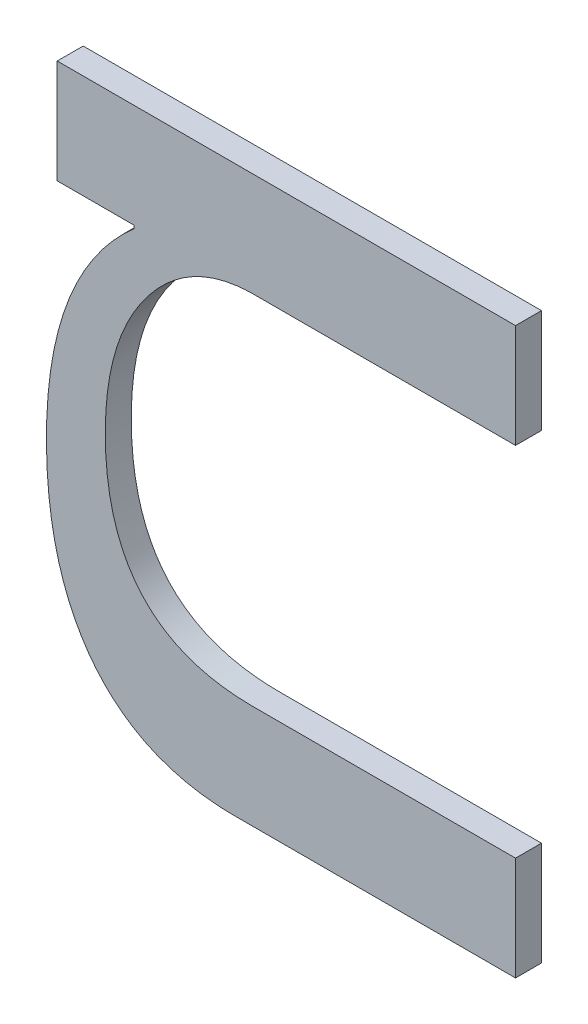
ISO-10303-21;
HEADER;
FILE_DESCRIPTION(('STEP AP214'),'2;1');
FILE_NAME('part.step','',(''),(''),'','','');
FILE_SCHEMA(('AUTOMOTIVE_DESIGN { 1 0 10303 214 1 1 1 1 }'));
ENDSEC;
DATA;
#1=APPLICATION_CONTEXT('core data for automotive mechanical design processes');
#2=APPLICATION_PROTOCOL_DEFINITION('international standard','automotive_design',2000,#1);
#3=PRODUCT_CONTEXT('',#1,'mechanical');
#4=PRODUCT('Part','Part','',(#3));
#5=PRODUCT_RELATED_PRODUCT_CATEGORY('part','',(#4));
#6=PRODUCT_DEFINITION_FORMATION('','',#4);
#7=PRODUCT_DEFINITION_CONTEXT('part definition',#1,'design');
#8=PRODUCT_DEFINITION('design','',#6,#7);
#9=PRODUCT_DEFINITION_SHAPE('','',#8);
#10=(LENGTH_UNIT() NAMED_UNIT(*) SI_UNIT(.MILLI.,.METRE.));
#11=(NAMED_UNIT(*) PLANE_ANGLE_UNIT() SI_UNIT($,.RADIAN.));
#12=(NAMED_UNIT(*) SI_UNIT($,.STERADIAN.) SOLID_ANGLE_UNIT());
#13=UNCERTAINTY_MEASURE_WITH_UNIT(LENGTH_MEASURE(1.E-05),#10,'distance_accuracy_value','');
#14=(GEOMETRIC_REPRESENTATION_CONTEXT(3) GLOBAL_UNCERTAINTY_ASSIGNED_CONTEXT((#13)) GLOBAL_UNIT_ASSIGNED_CONTEXT((#10,
#11,#12)) REPRESENTATION_CONTEXT('',''));
#15=CARTESIAN_POINT('',(0.,0.,0.));
#16=DIRECTION('',(0.,0.,1.));
#17=DIRECTION('',(1.,0.,0.));
#18=AXIS2_PLACEMENT_3D('',#15,#16,#17);
#19=CARTESIAN_POINT('',(-8.95983005625009,-22.770458436575,135.210489149433));
#20=DIRECTION('',(0.,0.,-1.));
#21=DIRECTION('',(0.,-1.,0.));
#22=AXIS2_PLACEMENT_3D('',#19,#20,#21);
#23=PLANE('',#22);
#24=CARTESIAN_POINT('',(-6.41452319026449,2.21337900735486,135.210489149433));
#25=CARTESIAN_POINT('',(-7.42338738324791,2.21337900735486,135.210489149433));
#26=CARTESIAN_POINT('',(-8.43225157623134,2.21337900735486,135.210489149433));
#27=CARTESIAN_POINT('',(-10.5840689654579,2.21337900735486,135.210489149433));
#28=CARTESIAN_POINT('',(-11.1555470427801,2.84072670043146,135.210489149433));
#29=CARTESIAN_POINT('',(-11.1555459531499,4.75150269201786,135.210489149433));
#30=CARTESIAN_POINT('',(-10.9919250064618,5.29025539691216,135.210489149433));
#31=CARTESIAN_POINT('',(-10.3374403582215,6.13310378538347,135.210489149433));
#32=CARTESIAN_POINT('',(-9.92798836002439,6.34381583127306,135.210489149433));
#33=CARTESIAN_POINT('',(-8.42905893822012,6.34381583127306,135.210489149433));
#34=CARTESIAN_POINT('',(-7.4217910642423,6.34381583127306,135.210489149433));
#35=CARTESIAN_POINT('',(-6.41452319026449,6.34381583127306,135.210489149433));
#36=(BOUNDED_CURVE() B_SPLINE_CURVE(3,(#24,#25,#26,#27,#28,#29,#30,#31,#32,#33,#34,#35),
.UNSPECIFIED.,.F.,.F.) B_SPLINE_CURVE_WITH_KNOTS((4,2,2,2,2,4),(0.,0.220684096034556,
0.47069950413109,0.601432808643403,0.732166223682619,1.),
.UNSPECIFIED.) CURVE() GEOMETRIC_REPRESENTATION_ITEM() RATIONAL_B_SPLINE_CURVE((1.,1.,1.,1.,1.,
1.,1.,1.,1.,1.,1.,1.)) REPRESENTATION_ITEM(''));
#37=CARTESIAN_POINT('',(-6.41452319026449,2.21337900735486,135.210489149433));
#38=VERTEX_POINT('',#37);
#39=CARTESIAN_POINT('',(-6.41452319026449,6.34381583127306,135.210489149433));
#40=VERTEX_POINT('',#39);
#41=EDGE_CURVE('E11',#38,#40,#36,.T.);
#42=ORIENTED_EDGE('',*,*,#41,.T.);
#43=DIRECTION('',(0.,1.,0.));
#44=VECTOR('',#43,1.);
#45=CARTESIAN_POINT('',(-6.41452319026449,5.40908312699247,135.210489149433));
#46=LINE('',#45,#44);
#47=CARTESIAN_POINT('',(-6.41452319026449,7.54343835230677,135.210489149433));
#48=VERTEX_POINT('',#47);
#49=EDGE_CURVE('E265',#40,#48,#46,.T.);
#50=ORIENTED_EDGE('',*,*,#49,.T.);
#51=DIRECTION('',(-1.,0.,0.));
#52=VECTOR('',#51,1.);
#53=CARTESIAN_POINT('',(2.66453525910038E-13,7.54343835230677,135.210489149433));
#54=LINE('',#53,#52);
#55=CARTESIAN_POINT('',(-11.7110601493991,7.54343835230677,135.210489149433));
#56=VERTEX_POINT('',#55);
#57=EDGE_CURVE('E241',#48,#56,#54,.T.);
#58=ORIENTED_EDGE('',*,*,#57,.T.);
#59=DIRECTION('',(0.,-1.,0.));
#60=VECTOR('',#59,1.);
#61=CARTESIAN_POINT('',(-11.7110601493991,5.40908312699247,135.210489149433));
#62=LINE('',#61,#60);
#63=CARTESIAN_POINT('',(-11.7110601493991,6.34381583127306,135.210489149433));
#64=VERTEX_POINT('',#63);
#65=EDGE_CURVE('E143',#56,#64,#62,.T.);
#66=ORIENTED_EDGE('',*,*,#65,.T.);
#67=DIRECTION('',(1.,0.,0.));
#68=VECTOR('',#67,1.);
#69=CARTESIAN_POINT('',(2.66453525910038E-13,6.34381583127306,135.210489149433));
#70=LINE('',#69,#68);
#71=CARTESIAN_POINT('',(-10.8251113813703,6.34381583127306,135.210489149433));
#72=VERTEX_POINT('',#71);
#73=EDGE_CURVE('E125',#64,#72,#70,.T.);
#74=ORIENTED_EDGE('',*,*,#73,.T.);
#75=DIRECTION('',(0.,-1.,0.));
#76=VECTOR('',#75,1.);
#77=CARTESIAN_POINT('',(-10.8251113813703,5.40908312699247,135.210489149433));
#78=LINE('',#77,#76);
#79=CARTESIAN_POINT('',(-10.8251113813703,6.30789898932597,135.210489149433));
#80=VERTEX_POINT('',#79);
#81=EDGE_CURVE('E116',#72,#80,#78,.T.);
#82=ORIENTED_EDGE('',*,*,#81,.T.);
#83=CARTESIAN_POINT('',(-10.8251113813703,6.30789898932597,135.210489149433));
#84=CARTESIAN_POINT('',(-11.4987515811782,5.71407405620057,135.210489149433));
#85=CARTESIAN_POINT('',(-11.8355718681491,4.84488648108036,135.210489149433));
#86=CARTESIAN_POINT('',(-11.8355718681491,2.82875460684916,135.210489149433));
#87=CARTESIAN_POINT('',(-11.6488042900241,2.16309542862887,135.210489149433));
#88=CARTESIAN_POINT('',(-10.9017339775241,1.24362427478276,135.210489149433));
#89=CARTESIAN_POINT('',(-10.3605868921876,1.01375648632117,135.210489149433));
#90=CARTESIAN_POINT('',(-8.57272629967559,1.01375648632117,135.210489149433));
#91=CARTESIAN_POINT('',(-7.49362474497004,1.01375648632117,135.210489149433));
#92=CARTESIAN_POINT('',(-6.41452319026449,1.01375648632117,135.210489149433));
#93=(BOUNDED_CURVE() B_SPLINE_CURVE(3,(#83,#84,#85,#86,#87,#88,#89,#90,#91,#92),.UNSPECIFIED.,
.F.,.F.) B_SPLINE_CURVE_WITH_KNOTS((4,2,2,2,4),(0.,0.271560462679199,0.47835532213715,
0.6851501815951,1.),
.UNSPECIFIED.) CURVE() GEOMETRIC_REPRESENTATION_ITEM() RATIONAL_B_SPLINE_CURVE((1.,1.,1.,1.,1.,
1.,1.,1.,1.,1.)) REPRESENTATION_ITEM(''));
#94=CARTESIAN_POINT('',(-6.41452319026449,1.01375648632117,135.210489149433));
#95=VERTEX_POINT('',#94);
#96=EDGE_CURVE('E185',#80,#95,#93,.T.);
#97=ORIENTED_EDGE('',*,*,#96,.T.);
#98=DIRECTION('',(0.,1.,0.));
#99=VECTOR('',#98,1.);
#100=CARTESIAN_POINT('',(-6.41452319026449,5.40908312699247,135.210489149433));
#101=LINE('',#100,#99);
#102=EDGE_CURVE('E206',#95,#38,#101,.T.);
#103=ORIENTED_EDGE('',*,*,#102,.T.);
#104=EDGE_LOOP('',(#42,#50,#58,#66,#74,#82,#97,#103));
#105=FACE_BOUND('',#104,.T.);
#106=ADVANCED_FACE('F42',(#105),#23,.F.);
#107=CARTESIAN_POINT('',(-6.41452319026449,2.21337900735486,135.410489149433));
#108=CARTESIAN_POINT('',(-7.42338738324791,2.21337900735486,135.410489149433));
#109=CARTESIAN_POINT('',(-8.43225157623134,2.21337900735486,135.410489149433));
#110=CARTESIAN_POINT('',(-10.5840689654579,2.21337900735486,135.410489149433));
#111=CARTESIAN_POINT('',(-11.1555470427801,2.84072670043146,135.410489149433));
#112=CARTESIAN_POINT('',(-11.1555459531499,4.75150269201786,135.410489149433));
#113=CARTESIAN_POINT('',(-10.9919250064618,5.29025539691216,135.410489149433));
#114=CARTESIAN_POINT('',(-10.3374403582215,6.13310378538347,135.410489149433));
#115=CARTESIAN_POINT('',(-9.92798836002439,6.34381583127306,135.410489149433));
#116=CARTESIAN_POINT('',(-8.42905893822012,6.34381583127306,135.410489149433));
#117=CARTESIAN_POINT('',(-7.4217910642423,6.34381583127306,135.410489149433));
#118=CARTESIAN_POINT('',(-6.41452319026449,6.34381583127306,135.410489149433));
#119=(BOUNDED_CURVE() B_SPLINE_CURVE(3,(#107,#108,#109,#110,#111,#112,#113,#114,#115,#116,#117,
#118),.UNSPECIFIED.,.F.,.F.) B_SPLINE_CURVE_WITH_KNOTS((4,2,2,2,2,4),(0.,0.220684096034556,
0.47069950413109,0.601432808643403,0.732166223682619,1.),
.UNSPECIFIED.) CURVE() GEOMETRIC_REPRESENTATION_ITEM() RATIONAL_B_SPLINE_CURVE((1.,1.,1.,1.,1.,
1.,1.,1.,1.,1.,1.,1.)) REPRESENTATION_ITEM(''));
#120=DIRECTION('',(0.,0.,-1.));
#121=VECTOR('',#120,1.);
#122=SURFACE_OF_LINEAR_EXTRUSION('',#119,#121);
#123=ORIENTED_EDGE('',*,*,#41,.F.);
#124=CARTESIAN_POINT('',(-6.41452319026449,2.21337900735486,135.210489149433));
#125=CARTESIAN_POINT('',(-6.41452319026449,2.21337900735486,134.910489149433));
#126=(BOUNDED_CURVE() B_SPLINE_CURVE(1,(#124,#125),.UNSPECIFIED.,.F.,
.F.) B_SPLINE_CURVE_WITH_KNOTS((2,2),(0.,1.),
.UNSPECIFIED.) CURVE() GEOMETRIC_REPRESENTATION_ITEM() RATIONAL_B_SPLINE_CURVE((1.,1.)) REPRESENTATION_ITEM(''));
#127=CARTESIAN_POINT('',(-6.41452319026449,2.21337900735486,134.910489149433));
#128=VERTEX_POINT('',#127);
#129=EDGE_CURVE('E271',#38,#128,#126,.T.);
#130=ORIENTED_EDGE('',*,*,#129,.T.);
#131=CARTESIAN_POINT('',(-6.41452319026449,6.34381583127306,134.910489149433));
#132=CARTESIAN_POINT('',(-7.4217910642423,6.34381583127306,134.910489149433));
#133=CARTESIAN_POINT('',(-8.42905893822012,6.34381583127306,134.910489149433));
#134=CARTESIAN_POINT('',(-9.92798836002439,6.34381583127306,134.910489149433));
#135=CARTESIAN_POINT('',(-10.3374403582215,6.13310378538347,134.910489149433));
#136=CARTESIAN_POINT('',(-10.9919250064618,5.29025539691216,134.910489149433));
#137=CARTESIAN_POINT('',(-11.1555459531499,4.75150269201786,134.910489149433));
#138=CARTESIAN_POINT('',(-11.1555470427801,2.84072670043146,134.910489149433));
#139=CARTESIAN_POINT('',(-10.5840689654579,2.21337900735486,134.910489149433));
#140=CARTESIAN_POINT('',(-8.43225157623134,2.21337900735486,134.910489149433));
#141=CARTESIAN_POINT('',(-7.42338738324791,2.21337900735486,134.910489149433));
#142=CARTESIAN_POINT('',(-6.41452319026449,2.21337900735486,134.910489149433));
#143=(BOUNDED_CURVE() B_SPLINE_CURVE(3,(#131,#132,#133,#134,#135,#136,#137,#138,#139,#140,#141,
#142),.UNSPECIFIED.,.F.,.F.) B_SPLINE_CURVE_WITH_KNOTS((4,2,2,2,2,4),(0.,0.267833776317381,
0.398567191356597,0.52930049586891,0.779315903965444,1.),
.UNSPECIFIED.) CURVE() GEOMETRIC_REPRESENTATION_ITEM() RATIONAL_B_SPLINE_CURVE((1.,1.,1.,1.,1.,
1.,1.,1.,1.,1.,1.,1.)) REPRESENTATION_ITEM(''));
#144=CARTESIAN_POINT('',(-6.41452319026449,6.34381583127306,134.910489149433));
#145=VERTEX_POINT('',#144);
#146=EDGE_CURVE('E256',#145,#128,#143,.T.);
#147=ORIENTED_EDGE('',*,*,#146,.F.);
#148=CARTESIAN_POINT('',(-6.41452319026449,6.34381583127306,135.210489149433));
#149=CARTESIAN_POINT('',(-6.41452319026449,6.34381583127306,135.110489149433));
#150=CARTESIAN_POINT('',(-6.41452319026449,6.34381583127306,135.010489149433));
#151=CARTESIAN_POINT('',(-6.41452319026449,6.34381583127306,134.910489149433));
#152=(BOUNDED_CURVE() B_SPLINE_CURVE(3,(#148,#149,#150,#151),.UNSPECIFIED.,.F.,
.F.) B_SPLINE_CURVE_WITH_KNOTS((4,4),(0.,1.),
.UNSPECIFIED.) CURVE() GEOMETRIC_REPRESENTATION_ITEM() RATIONAL_B_SPLINE_CURVE((1.,1.,1.,1.)) REPRESENTATION_ITEM(''));
#153=EDGE_CURVE('E56',#40,#145,#152,.T.);
#154=ORIENTED_EDGE('',*,*,#153,.F.);
#155=EDGE_LOOP('',(#123,#130,#147,#154));
#156=FACE_BOUND('',#155,.T.);
#157=ADVANCED_FACE('F44',(#156),#122,.F.);
#158=CARTESIAN_POINT('',(-6.41452319026449,7.54343835230677,135.410489149433));
#159=DIRECTION('',(1.,0.,0.));
#160=DIRECTION('',(0.,1.,0.));
#161=AXIS2_PLACEMENT_3D('',#158,#159,#160);
#162=PLANE('',#161);
#163=ORIENTED_EDGE('',*,*,#49,.F.);
#164=ORIENTED_EDGE('',*,*,#153,.T.);
#165=CARTESIAN_POINT('',(-6.41452319026449,7.54343835230677,134.910489149433));
#166=CARTESIAN_POINT('',(-6.41452319026449,7.14356417862886,134.910489149433));
#167=CARTESIAN_POINT('',(-6.41452319026449,6.74369000495097,134.910489149433));
#168=CARTESIAN_POINT('',(-6.41452319026449,6.34381583127306,134.910489149433));
#169=(BOUNDED_CURVE() B_SPLINE_CURVE(3,(#165,#166,#167,#168),.UNSPECIFIED.,.F.,
.F.) B_SPLINE_CURVE_WITH_KNOTS((4,4),(0.,1.),
.UNSPECIFIED.) CURVE() GEOMETRIC_REPRESENTATION_ITEM() RATIONAL_B_SPLINE_CURVE((1.,1.,1.,1.)) REPRESENTATION_ITEM(''));
#170=CARTESIAN_POINT('',(-6.41452319026449,7.54343835230677,134.910489149433));
#171=VERTEX_POINT('',#170);
#172=EDGE_CURVE('E47',#171,#145,#169,.T.);
#173=ORIENTED_EDGE('',*,*,#172,.F.);
#174=CARTESIAN_POINT('',(-6.41452319026449,7.54343835230677,135.210489149433));
#175=CARTESIAN_POINT('',(-6.41452319026449,7.54343835230677,135.110489149433));
#176=CARTESIAN_POINT('',(-6.41452319026449,7.54343835230677,135.010489149433));
#177=CARTESIAN_POINT('',(-6.41452319026449,7.54343835230677,134.910489149433));
#178=(BOUNDED_CURVE() B_SPLINE_CURVE(3,(#174,#175,#176,#177),.UNSPECIFIED.,.F.,
.F.) B_SPLINE_CURVE_WITH_KNOTS((4,4),(0.,1.),
.UNSPECIFIED.) CURVE() GEOMETRIC_REPRESENTATION_ITEM() RATIONAL_B_SPLINE_CURVE((1.,1.,1.,1.)) REPRESENTATION_ITEM(''));
#179=EDGE_CURVE('E228',#48,#171,#178,.T.);
#180=ORIENTED_EDGE('',*,*,#179,.F.);
#181=EDGE_LOOP('',(#163,#164,#173,#180));
#182=FACE_BOUND('',#181,.T.);
#183=ADVANCED_FACE('F317',(#182),#162,.T.);
#184=CARTESIAN_POINT('',(-6.41452319026449,2.21337900735486,135.410489149433));
#185=DIRECTION('',(1.,0.,0.));
#186=DIRECTION('',(0.,1.,0.));
#187=AXIS2_PLACEMENT_3D('',#184,#185,#186);
#188=PLANE('',#187);
#189=ORIENTED_EDGE('',*,*,#102,.F.);
#190=CARTESIAN_POINT('',(-6.41452319026449,1.01375648632115,135.210489149433));
#191=CARTESIAN_POINT('',(-6.41452319026449,1.01375648632115,135.110489149433));
#192=CARTESIAN_POINT('',(-6.41452319026449,1.01375648632115,135.010489149433));
#193=CARTESIAN_POINT('',(-6.41452319026449,1.01375648632115,134.910489149433));
#194=(BOUNDED_CURVE() B_SPLINE_CURVE(3,(#190,#191,#192,#193),.UNSPECIFIED.,.F.,
.F.) B_SPLINE_CURVE_WITH_KNOTS((4,4),(0.,1.),
.UNSPECIFIED.) CURVE() GEOMETRIC_REPRESENTATION_ITEM() RATIONAL_B_SPLINE_CURVE((1.,1.,1.,1.)) REPRESENTATION_ITEM(''));
#195=CARTESIAN_POINT('',(-6.41452319026449,1.01375648632117,134.910489149433));
#196=VERTEX_POINT('',#195);
#197=EDGE_CURVE('E193',#95,#196,#194,.T.);
#198=ORIENTED_EDGE('',*,*,#197,.T.);
#199=CARTESIAN_POINT('',(-6.41452319026449,2.21337900735486,134.910489149433));
#200=CARTESIAN_POINT('',(-6.41452319026449,1.81350483367697,134.910489149433));
#201=CARTESIAN_POINT('',(-6.41452319026449,1.41363065999906,134.910489149433));
#202=CARTESIAN_POINT('',(-6.41452319026449,1.01375648632117,134.910489149433));
#203=(BOUNDED_CURVE() B_SPLINE_CURVE(3,(#199,#200,#201,#202),.UNSPECIFIED.,.F.,
.F.) B_SPLINE_CURVE_WITH_KNOTS((4,4),(0.,1.),
.UNSPECIFIED.) CURVE() GEOMETRIC_REPRESENTATION_ITEM() RATIONAL_B_SPLINE_CURVE((1.,1.,1.,1.)) REPRESENTATION_ITEM(''));
#204=EDGE_CURVE('E248',#128,#196,#203,.T.);
#205=ORIENTED_EDGE('',*,*,#204,.F.);
#206=ORIENTED_EDGE('',*,*,#129,.F.);
#207=EDGE_LOOP('',(#189,#198,#205,#206));
#208=FACE_BOUND('',#207,.T.);
#209=ADVANCED_FACE('F337',(#208),#188,.T.);
#210=CARTESIAN_POINT('',(-10.8251113813703,6.30789898932597,135.410489149433));
#211=CARTESIAN_POINT('',(-11.4987515811782,5.71407405620057,135.410489149433));
#212=CARTESIAN_POINT('',(-11.8355718681491,4.84488648108036,135.410489149433));
#213=CARTESIAN_POINT('',(-11.8355718681491,2.82875460684916,135.410489149433));
#214=CARTESIAN_POINT('',(-11.6488042900241,2.16309542862887,135.410489149433));
#215=CARTESIAN_POINT('',(-10.9017339775241,1.24362427478276,135.410489149433));
#216=CARTESIAN_POINT('',(-10.3605868921876,1.01375648632117,135.410489149433));
#217=CARTESIAN_POINT('',(-8.57272629967559,1.01375648632117,135.410489149433));
#218=CARTESIAN_POINT('',(-7.49362474497004,1.01375648632117,135.410489149433));
#219=CARTESIAN_POINT('',(-6.41452319026449,1.01375648632117,135.410489149433));
#220=(BOUNDED_CURVE() B_SPLINE_CURVE(3,(#210,#211,#212,#213,#214,#215,#216,#217,#218,#219),
.UNSPECIFIED.,.F.,.F.) B_SPLINE_CURVE_WITH_KNOTS((4,2,2,2,4),(0.,0.271560462679199,
0.47835532213715,0.6851501815951,1.),
.UNSPECIFIED.) CURVE() GEOMETRIC_REPRESENTATION_ITEM() RATIONAL_B_SPLINE_CURVE((1.,1.,1.,1.,1.,
1.,1.,1.,1.,1.)) REPRESENTATION_ITEM(''));
#221=DIRECTION('',(0.,0.,-1.));
#222=VECTOR('',#221,1.);
#223=SURFACE_OF_LINEAR_EXTRUSION('',#220,#222);
#224=ORIENTED_EDGE('',*,*,#96,.F.);
#225=CARTESIAN_POINT('',(-10.8251113813703,6.30789898932597,135.210489149433));
#226=CARTESIAN_POINT('',(-10.8251113813703,6.30789898932597,134.910489149433));
#227=(BOUNDED_CURVE() B_SPLINE_CURVE(1,(#225,#226),.UNSPECIFIED.,.F.,
.F.) B_SPLINE_CURVE_WITH_KNOTS((2,2),(0.,1.),
.UNSPECIFIED.) CURVE() GEOMETRIC_REPRESENTATION_ITEM() RATIONAL_B_SPLINE_CURVE((1.,1.)) REPRESENTATION_ITEM(''));
#228=CARTESIAN_POINT('',(-10.8251113813703,6.30789898932597,134.910489149433));
#229=VERTEX_POINT('',#228);
#230=EDGE_CURVE('E194',#80,#229,#227,.T.);
#231=ORIENTED_EDGE('',*,*,#230,.T.);
#232=CARTESIAN_POINT('',(-6.41452319026449,1.01375648632117,134.910489149433));
#233=CARTESIAN_POINT('',(-7.49362474497004,1.01375648632117,134.910489149433));
#234=CARTESIAN_POINT('',(-8.57272629967559,1.01375648632117,134.910489149433));
#235=CARTESIAN_POINT('',(-10.3605868921876,1.01375648632117,134.910489149433));
#236=CARTESIAN_POINT('',(-10.9017339775241,1.24362427478276,134.910489149433));
#237=CARTESIAN_POINT('',(-11.6488042900241,2.16309542862887,134.910489149433));
#238=CARTESIAN_POINT('',(-11.8355718681491,2.82875460684916,134.910489149433));
#239=CARTESIAN_POINT('',(-11.8355718681491,4.84488648108036,134.910489149433));
#240=CARTESIAN_POINT('',(-11.4987515811782,5.71407405620057,134.910489149433));
#241=CARTESIAN_POINT('',(-10.8251113813703,6.30789898932597,134.910489149433));
#242=(BOUNDED_CURVE() B_SPLINE_CURVE(3,(#232,#233,#234,#235,#236,#237,#238,#239,#240,#241),
.UNSPECIFIED.,.F.,.F.) B_SPLINE_CURVE_WITH_KNOTS((4,2,2,2,4),(0.,0.3148498184049,
0.52164467786285,0.728439537320801,1.),
.UNSPECIFIED.) CURVE() GEOMETRIC_REPRESENTATION_ITEM() RATIONAL_B_SPLINE_CURVE((1.,1.,1.,1.,1.,
1.,1.,1.,1.,1.)) REPRESENTATION_ITEM(''));
#243=EDGE_CURVE('E166',#196,#229,#242,.T.);
#244=ORIENTED_EDGE('',*,*,#243,.F.);
#245=ORIENTED_EDGE('',*,*,#197,.F.);
#246=EDGE_LOOP('',(#224,#231,#244,#245));
#247=FACE_BOUND('',#246,.T.);
#248=ADVANCED_FACE('F359',(#247),#223,.F.);
#249=CARTESIAN_POINT('',(-10.8251113813703,6.30789898932597,135.410489149433));
#250=DIRECTION('',(-1.,0.,0.));
#251=DIRECTION('',(0.,0.,1.));
#252=AXIS2_PLACEMENT_3D('',#249,#250,#251);
#253=PLANE('',#252);
#254=ORIENTED_EDGE('',*,*,#81,.F.);
#255=CARTESIAN_POINT('',(-10.8251113813703,6.34381583127307,135.210489149433));
#256=CARTESIAN_POINT('',(-10.8251113813703,6.34381583127307,135.110489149433));
#257=CARTESIAN_POINT('',(-10.8251113813703,6.34381583127307,135.010489149433));
#258=CARTESIAN_POINT('',(-10.8251113813703,6.34381583127307,134.910489149433));
#259=(BOUNDED_CURVE() B_SPLINE_CURVE(3,(#255,#256,#257,#258),.UNSPECIFIED.,.F.,
.F.) B_SPLINE_CURVE_WITH_KNOTS((4,4),(0.,1.),
.UNSPECIFIED.) CURVE() GEOMETRIC_REPRESENTATION_ITEM() RATIONAL_B_SPLINE_CURVE((1.,1.,1.,1.)) REPRESENTATION_ITEM(''));
#260=CARTESIAN_POINT('',(-10.8251113813703,6.34381583127306,134.910489149433));
#261=VERTEX_POINT('',#260);
#262=EDGE_CURVE('E173',#72,#261,#259,.T.);
#263=ORIENTED_EDGE('',*,*,#262,.T.);
#264=CARTESIAN_POINT('',(-10.8251113813703,6.30789898932597,134.910489149433));
#265=CARTESIAN_POINT('',(-10.8251113813703,6.31987126997506,134.910489149433));
#266=CARTESIAN_POINT('',(-10.8251113813703,6.33184355062406,134.910489149433));
#267=CARTESIAN_POINT('',(-10.8251113813703,6.34381583127306,134.910489149433));
#268=(BOUNDED_CURVE() B_SPLINE_CURVE(3,(#264,#265,#266,#267),.UNSPECIFIED.,.F.,
.F.) B_SPLINE_CURVE_WITH_KNOTS((4,4),(0.,1.),
.UNSPECIFIED.) CURVE() GEOMETRIC_REPRESENTATION_ITEM() RATIONAL_B_SPLINE_CURVE((1.,1.,1.,1.)) REPRESENTATION_ITEM(''));
#269=EDGE_CURVE('E159',#229,#261,#268,.T.);
#270=ORIENTED_EDGE('',*,*,#269,.F.);
#271=ORIENTED_EDGE('',*,*,#230,.F.);
#272=EDGE_LOOP('',(#254,#263,#270,#271));
#273=FACE_BOUND('',#272,.T.);
#274=ADVANCED_FACE('F329',(#273),#253,.T.);
#275=CARTESIAN_POINT('',(-10.8251113813703,6.34381583127306,135.410489149433));
#276=DIRECTION('',(0.,-1.,0.));
#277=DIRECTION('',(0.,0.,-1.));
#278=AXIS2_PLACEMENT_3D('',#275,#276,#277);
#279=PLANE('',#278);
#280=ORIENTED_EDGE('',*,*,#73,.F.);
#281=CARTESIAN_POINT('',(-11.7110601493991,6.34381583127306,134.910489149433));
#282=CARTESIAN_POINT('',(-11.7110601493991,6.34381583127306,135.010489149433));
#283=CARTESIAN_POINT('',(-11.7110601493991,6.34381583127306,135.110489149433));
#284=CARTESIAN_POINT('',(-11.7110601493991,6.34381583127306,135.210489149433));
#285=(BOUNDED_CURVE() B_SPLINE_CURVE(3,(#281,#282,#283,#284),.UNSPECIFIED.,.F.,
.F.) B_SPLINE_CURVE_WITH_KNOTS((4,4),(0.,1.),
.UNSPECIFIED.) CURVE() GEOMETRIC_REPRESENTATION_ITEM() RATIONAL_B_SPLINE_CURVE((1.,1.,1.,1.)) REPRESENTATION_ITEM(''));
#286=CARTESIAN_POINT('',(-11.7110601493991,6.34381583127306,134.910489149433));
#287=VERTEX_POINT('',#286);
#288=EDGE_CURVE('E134',#287,#64,#285,.T.);
#289=ORIENTED_EDGE('',*,*,#288,.F.);
#290=CARTESIAN_POINT('',(-10.8251113813703,6.34381583127306,134.910489149433));
#291=CARTESIAN_POINT('',(-11.1204276373799,6.34381583127306,134.910489149433));
#292=CARTESIAN_POINT('',(-11.4157438933895,6.34381583127306,134.910489149433));
#293=CARTESIAN_POINT('',(-11.7110601493991,6.34381583127306,134.910489149433));
#294=(BOUNDED_CURVE() B_SPLINE_CURVE(3,(#290,#291,#292,#293),.UNSPECIFIED.,.F.,
.F.) B_SPLINE_CURVE_WITH_KNOTS((4,4),(0.,1.),
.UNSPECIFIED.) CURVE() GEOMETRIC_REPRESENTATION_ITEM() RATIONAL_B_SPLINE_CURVE((1.,1.,1.,1.)) REPRESENTATION_ITEM(''));
#295=EDGE_CURVE('E138',#261,#287,#294,.T.);
#296=ORIENTED_EDGE('',*,*,#295,.F.);
#297=ORIENTED_EDGE('',*,*,#262,.F.);
#298=EDGE_LOOP('',(#280,#289,#296,#297));
#299=FACE_BOUND('',#298,.T.);
#300=ADVANCED_FACE('F136',(#299),#279,.T.);
#301=CARTESIAN_POINT('',(-11.7110601493991,6.34381583127306,135.410489149433));
#302=DIRECTION('',(-1.,0.,0.));
#303=DIRECTION('',(0.,0.,1.));
#304=AXIS2_PLACEMENT_3D('',#301,#302,#303);
#305=PLANE('',#304);
#306=ORIENTED_EDGE('',*,*,#65,.F.);
#307=CARTESIAN_POINT('',(-11.7110601493991,7.54343835230677,135.210489149433));
#308=CARTESIAN_POINT('',(-11.7110601493991,7.54343835230677,135.110489149433));
#309=CARTESIAN_POINT('',(-11.7110601493991,7.54343835230677,135.010489149433));
#310=CARTESIAN_POINT('',(-11.7110601493991,7.54343835230677,134.910489149433));
#311=(BOUNDED_CURVE() B_SPLINE_CURVE(3,(#307,#308,#309,#310),.UNSPECIFIED.,.F.,
.F.) B_SPLINE_CURVE_WITH_KNOTS((4,4),(0.,1.),
.UNSPECIFIED.) CURVE() GEOMETRIC_REPRESENTATION_ITEM() RATIONAL_B_SPLINE_CURVE((1.,1.,1.,1.)) REPRESENTATION_ITEM(''));
#312=CARTESIAN_POINT('',(-11.7110601493991,7.54343835230677,134.910489149433));
#313=VERTEX_POINT('',#312);
#314=EDGE_CURVE('E149',#56,#313,#311,.T.);
#315=ORIENTED_EDGE('',*,*,#314,.T.);
#316=CARTESIAN_POINT('',(-11.7110601493991,6.34381583127306,134.910489149433));
#317=CARTESIAN_POINT('',(-11.7110601493991,6.74369000495097,134.910489149433));
#318=CARTESIAN_POINT('',(-11.7110601493991,7.14356417862886,134.910489149433));
#319=CARTESIAN_POINT('',(-11.7110601493991,7.54343835230677,134.910489149433));
#320=(BOUNDED_CURVE() B_SPLINE_CURVE(3,(#316,#317,#318,#319),.UNSPECIFIED.,.F.,
.F.) B_SPLINE_CURVE_WITH_KNOTS((4,4),(0.,1.),
.UNSPECIFIED.) CURVE() GEOMETRIC_REPRESENTATION_ITEM() RATIONAL_B_SPLINE_CURVE((1.,1.,1.,1.)) REPRESENTATION_ITEM(''));
#321=EDGE_CURVE('E146',#287,#313,#320,.T.);
#322=ORIENTED_EDGE('',*,*,#321,.F.);
#323=ORIENTED_EDGE('',*,*,#288,.T.);
#324=EDGE_LOOP('',(#306,#315,#322,#323));
#325=FACE_BOUND('',#324,.T.);
#326=ADVANCED_FACE('F147',(#325),#305,.T.);
#327=CARTESIAN_POINT('',(-11.7110601493991,7.54343835230677,135.410489149433));
#328=DIRECTION('',(0.,1.,0.));
#329=DIRECTION('',(1.,0.,0.));
#330=AXIS2_PLACEMENT_3D('',#327,#328,#329);
#331=PLANE('',#330);
#332=ORIENTED_EDGE('',*,*,#57,.F.);
#333=ORIENTED_EDGE('',*,*,#179,.T.);
#334=CARTESIAN_POINT('',(-11.7110601493991,7.54343835230677,134.910489149433));
#335=CARTESIAN_POINT('',(-9.94554782968757,7.54343835230677,134.910489149433));
#336=CARTESIAN_POINT('',(-8.18003550997603,7.54343835230677,134.910489149433));
#337=CARTESIAN_POINT('',(-6.41452319026449,7.54343835230677,134.910489149433));
#338=(BOUNDED_CURVE() B_SPLINE_CURVE(3,(#334,#335,#336,#337),.UNSPECIFIED.,.F.,
.F.) B_SPLINE_CURVE_WITH_KNOTS((4,4),(0.,1.),
.UNSPECIFIED.) CURVE() GEOMETRIC_REPRESENTATION_ITEM() RATIONAL_B_SPLINE_CURVE((1.,1.,1.,1.)) REPRESENTATION_ITEM(''));
#339=EDGE_CURVE('E154',#313,#171,#338,.T.);
#340=ORIENTED_EDGE('',*,*,#339,.F.);
#341=ORIENTED_EDGE('',*,*,#314,.F.);
#342=EDGE_LOOP('',(#332,#333,#340,#341));
#343=FACE_BOUND('',#342,.T.);
#344=ADVANCED_FACE('F319',(#343),#331,.T.);
#345=CARTESIAN_POINT('',(-11.1308892731607,4.51887169385887,134.910489149433));
#346=DIRECTION('',(0.,0.,-1.));
#347=DIRECTION('',(0.,-1.,0.));
#348=AXIS2_PLACEMENT_3D('',#345,#346,#347);
#349=PLANE('',#348);
#350=ORIENTED_EDGE('',*,*,#172,.T.);
#351=ORIENTED_EDGE('',*,*,#146,.T.);
#352=ORIENTED_EDGE('',*,*,#204,.T.);
#353=ORIENTED_EDGE('',*,*,#243,.T.);
#354=ORIENTED_EDGE('',*,*,#269,.T.);
#355=ORIENTED_EDGE('',*,*,#295,.T.);
#356=ORIENTED_EDGE('',*,*,#321,.T.);
#357=ORIENTED_EDGE('',*,*,#339,.T.);
#358=EDGE_LOOP('',(#350,#351,#352,#353,#354,#355,#356,#357));
#359=FACE_BOUND('',#358,.T.);
#360=ADVANCED_FACE('F156',(#359),#349,.T.);
#361=CLOSED_SHELL('',(#106,#157,#183,#209,#248,#274,#300,#326,#344,#360));
#362=MANIFOLD_SOLID_BREP('B2',#361);
#363=ADVANCED_BREP_SHAPE_REPRESENTATION('',(#18,#362),#14);
#364=SHAPE_DEFINITION_REPRESENTATION(#9,#363);
ENDSEC;
END-ISO-10303-21;
